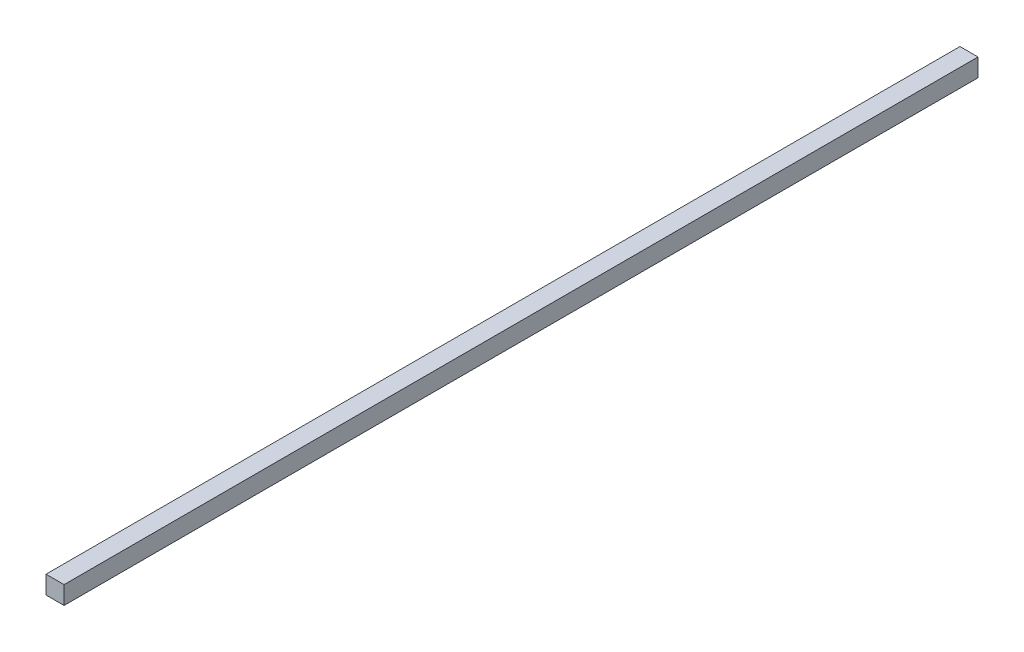
ISO-10303-21;
HEADER;
FILE_DESCRIPTION(('STEP AP214'),'2;1');
FILE_NAME('part.step','',(''),(''),'','','');
FILE_SCHEMA(('AUTOMOTIVE_DESIGN { 1 0 10303 214 1 1 1 1 }'));
ENDSEC;
DATA;
#1=APPLICATION_CONTEXT('core data for automotive mechanical design processes');
#2=APPLICATION_PROTOCOL_DEFINITION('international standard','automotive_design',2000,#1);
#3=PRODUCT_CONTEXT('',#1,'mechanical');
#4=PRODUCT('Part','Part','',(#3));
#5=PRODUCT_RELATED_PRODUCT_CATEGORY('part','',(#4));
#6=PRODUCT_DEFINITION_FORMATION('','',#4);
#7=PRODUCT_DEFINITION_CONTEXT('part definition',#1,'design');
#8=PRODUCT_DEFINITION('design','',#6,#7);
#9=PRODUCT_DEFINITION_SHAPE('','',#8);
#10=(LENGTH_UNIT() NAMED_UNIT(*) SI_UNIT(.MILLI.,.METRE.));
#11=(NAMED_UNIT(*) PLANE_ANGLE_UNIT() SI_UNIT($,.RADIAN.));
#12=(NAMED_UNIT(*) SI_UNIT($,.STERADIAN.) SOLID_ANGLE_UNIT());
#13=UNCERTAINTY_MEASURE_WITH_UNIT(LENGTH_MEASURE(1.E-05),#10,'distance_accuracy_value','');
#14=(GEOMETRIC_REPRESENTATION_CONTEXT(3) GLOBAL_UNCERTAINTY_ASSIGNED_CONTEXT((#13)) GLOBAL_UNIT_ASSIGNED_CONTEXT((#10,
#11,#12)) REPRESENTATION_CONTEXT('',''));
#15=CARTESIAN_POINT('',(0.,0.,0.));
#16=DIRECTION('',(0.,0.,1.));
#17=DIRECTION('',(1.,0.,0.));
#18=AXIS2_PLACEMENT_3D('',#15,#16,#17);
#19=CARTESIAN_POINT('',(3.175,3.175,321.31));
#20=DIRECTION('',(-1.,0.,0.));
#21=DIRECTION('',(0.,-1.,0.));
#22=AXIS2_PLACEMENT_3D('',#19,#20,#21);
#23=PLANE('',#22);
#24=DIRECTION('',(0.,1.,0.));
#25=VECTOR('',#24,1.);
#26=CARTESIAN_POINT('',(3.175,3.175,0.));
#27=LINE('',#26,#25);
#28=CARTESIAN_POINT('',(3.175,-3.175,0.));
#29=VERTEX_POINT('',#28);
#30=CARTESIAN_POINT('',(3.175,3.175,0.));
#31=VERTEX_POINT('',#30);
#32=EDGE_CURVE('E107',#29,#31,#27,.T.);
#33=ORIENTED_EDGE('',*,*,#32,.T.);
#34=DIRECTION('',(0.,0.,-1.));
#35=VECTOR('',#34,1.);
#36=CARTESIAN_POINT('',(3.175,3.175,321.31));
#37=LINE('',#36,#35);
#38=CARTESIAN_POINT('',(3.175,3.175,321.31));
#39=VERTEX_POINT('',#38);
#40=EDGE_CURVE('E11',#39,#31,#37,.T.);
#41=ORIENTED_EDGE('',*,*,#40,.F.);
#42=DIRECTION('',(0.,1.,0.));
#43=VECTOR('',#42,1.);
#44=CARTESIAN_POINT('',(3.175,3.175,321.31));
#45=LINE('',#44,#43);
#46=CARTESIAN_POINT('',(3.175,-3.175,321.31));
#47=VERTEX_POINT('',#46);
#48=EDGE_CURVE('E91',#47,#39,#45,.T.);
#49=ORIENTED_EDGE('',*,*,#48,.F.);
#50=DIRECTION('',(0.,0.,-1.));
#51=VECTOR('',#50,1.);
#52=CARTESIAN_POINT('',(3.175,-3.175,321.31));
#53=LINE('',#52,#51);
#54=EDGE_CURVE('E103',#47,#29,#53,.T.);
#55=ORIENTED_EDGE('',*,*,#54,.T.);
#56=EDGE_LOOP('',(#33,#41,#49,#55));
#57=FACE_BOUND('',#56,.T.);
#58=ADVANCED_FACE('F39',(#57),#23,.F.);
#59=CARTESIAN_POINT('',(-3.175,3.175,321.31));
#60=DIRECTION('',(0.,-1.,0.));
#61=DIRECTION('',(0.,0.,-1.));
#62=AXIS2_PLACEMENT_3D('',#59,#60,#61);
#63=PLANE('',#62);
#64=DIRECTION('',(-1.,0.,0.));
#65=VECTOR('',#64,1.);
#66=CARTESIAN_POINT('',(-3.175,3.175,0.));
#67=LINE('',#66,#65);
#68=CARTESIAN_POINT('',(-3.175,3.175,0.));
#69=VERTEX_POINT('',#68);
#70=EDGE_CURVE('E96',#31,#69,#67,.T.);
#71=ORIENTED_EDGE('',*,*,#70,.T.);
#72=DIRECTION('',(0.,0.,-1.));
#73=VECTOR('',#72,1.);
#74=CARTESIAN_POINT('',(-3.175,3.175,321.31));
#75=LINE('',#74,#73);
#76=CARTESIAN_POINT('',(-3.175,3.175,321.31));
#77=VERTEX_POINT('',#76);
#78=EDGE_CURVE('E48',#77,#69,#75,.T.);
#79=ORIENTED_EDGE('',*,*,#78,.F.);
#80=DIRECTION('',(-1.,0.,0.));
#81=VECTOR('',#80,1.);
#82=CARTESIAN_POINT('',(-3.175,3.175,321.31));
#83=LINE('',#82,#81);
#84=EDGE_CURVE('E86',#39,#77,#83,.T.);
#85=ORIENTED_EDGE('',*,*,#84,.F.);
#86=ORIENTED_EDGE('',*,*,#40,.T.);
#87=EDGE_LOOP('',(#71,#79,#85,#86));
#88=FACE_BOUND('',#87,.T.);
#89=ADVANCED_FACE('F95',(#88),#63,.F.);
#90=CARTESIAN_POINT('',(-3.175,3.175,321.31));
#91=DIRECTION('',(1.,0.,0.));
#92=DIRECTION('',(0.,0.,-1.));
#93=AXIS2_PLACEMENT_3D('',#90,#91,#92);
#94=PLANE('',#93);
#95=DIRECTION('',(0.,-1.,0.));
#96=VECTOR('',#95,1.);
#97=CARTESIAN_POINT('',(-3.175,3.175,0.));
#98=LINE('',#97,#96);
#99=CARTESIAN_POINT('',(-3.175,-3.175,0.));
#100=VERTEX_POINT('',#99);
#101=EDGE_CURVE('E73',#69,#100,#98,.T.);
#102=ORIENTED_EDGE('',*,*,#101,.T.);
#103=DIRECTION('',(0.,0.,-1.));
#104=VECTOR('',#103,1.);
#105=CARTESIAN_POINT('',(-3.175,-3.175,321.31));
#106=LINE('',#105,#104);
#107=CARTESIAN_POINT('',(-3.175,-3.175,321.31));
#108=VERTEX_POINT('',#107);
#109=EDGE_CURVE('E98',#108,#100,#106,.T.);
#110=ORIENTED_EDGE('',*,*,#109,.F.);
#111=DIRECTION('',(0.,-1.,0.));
#112=VECTOR('',#111,1.);
#113=CARTESIAN_POINT('',(-3.175,3.175,321.31));
#114=LINE('',#113,#112);
#115=EDGE_CURVE('E89',#77,#108,#114,.T.);
#116=ORIENTED_EDGE('',*,*,#115,.F.);
#117=ORIENTED_EDGE('',*,*,#78,.T.);
#118=EDGE_LOOP('',(#102,#110,#116,#117));
#119=FACE_BOUND('',#118,.T.);
#120=ADVANCED_FACE('F99',(#119),#94,.F.);
#121=CARTESIAN_POINT('',(-3.175,-3.175,321.31));
#122=DIRECTION('',(0.,1.,0.));
#123=DIRECTION('',(0.,0.,1.));
#124=AXIS2_PLACEMENT_3D('',#121,#122,#123);
#125=PLANE('',#124);
#126=DIRECTION('',(1.,0.,0.));
#127=VECTOR('',#126,1.);
#128=CARTESIAN_POINT('',(-3.175,-3.175,0.));
#129=LINE('',#128,#127);
#130=EDGE_CURVE('E79',#100,#29,#129,.T.);
#131=ORIENTED_EDGE('',*,*,#130,.T.);
#132=ORIENTED_EDGE('',*,*,#54,.F.);
#133=DIRECTION('',(1.,0.,0.));
#134=VECTOR('',#133,1.);
#135=CARTESIAN_POINT('',(-3.175,-3.175,321.31));
#136=LINE('',#135,#134);
#137=EDGE_CURVE('E56',#108,#47,#136,.T.);
#138=ORIENTED_EDGE('',*,*,#137,.F.);
#139=ORIENTED_EDGE('',*,*,#109,.T.);
#140=EDGE_LOOP('',(#131,#132,#138,#139));
#141=FACE_BOUND('',#140,.T.);
#142=ADVANCED_FACE('F120',(#141),#125,.F.);
#143=CARTESIAN_POINT('',(0.,0.,321.31));
#144=DIRECTION('',(0.,0.,1.));
#145=DIRECTION('',(1.,0.,0.));
#146=AXIS2_PLACEMENT_3D('',#143,#144,#145);
#147=PLANE('',#146);
#148=ORIENTED_EDGE('',*,*,#48,.T.);
#149=ORIENTED_EDGE('',*,*,#84,.T.);
#150=ORIENTED_EDGE('',*,*,#115,.T.);
#151=ORIENTED_EDGE('',*,*,#137,.T.);
#152=EDGE_LOOP('',(#148,#149,#150,#151));
#153=FACE_BOUND('',#152,.T.);
#154=ADVANCED_FACE('F87',(#153),#147,.T.);
#155=CARTESIAN_POINT('',(0.,0.,0.));
#156=DIRECTION('',(0.,0.,1.));
#157=DIRECTION('',(1.,0.,0.));
#158=AXIS2_PLACEMENT_3D('',#155,#156,#157);
#159=PLANE('',#158);
#160=ORIENTED_EDGE('',*,*,#32,.F.);
#161=ORIENTED_EDGE('',*,*,#130,.F.);
#162=ORIENTED_EDGE('',*,*,#101,.F.);
#163=ORIENTED_EDGE('',*,*,#70,.F.);
#164=EDGE_LOOP('',(#160,#161,#162,#163));
#165=FACE_BOUND('',#164,.T.);
#166=ADVANCED_FACE('F123',(#165),#159,.F.);
#167=CLOSED_SHELL('',(#58,#89,#120,#142,#154,#166));
#168=MANIFOLD_SOLID_BREP('B2',#167);
#169=ADVANCED_BREP_SHAPE_REPRESENTATION('',(#18,#168),#14);
#170=SHAPE_DEFINITION_REPRESENTATION(#9,#169);
ENDSEC;
END-ISO-10303-21;
